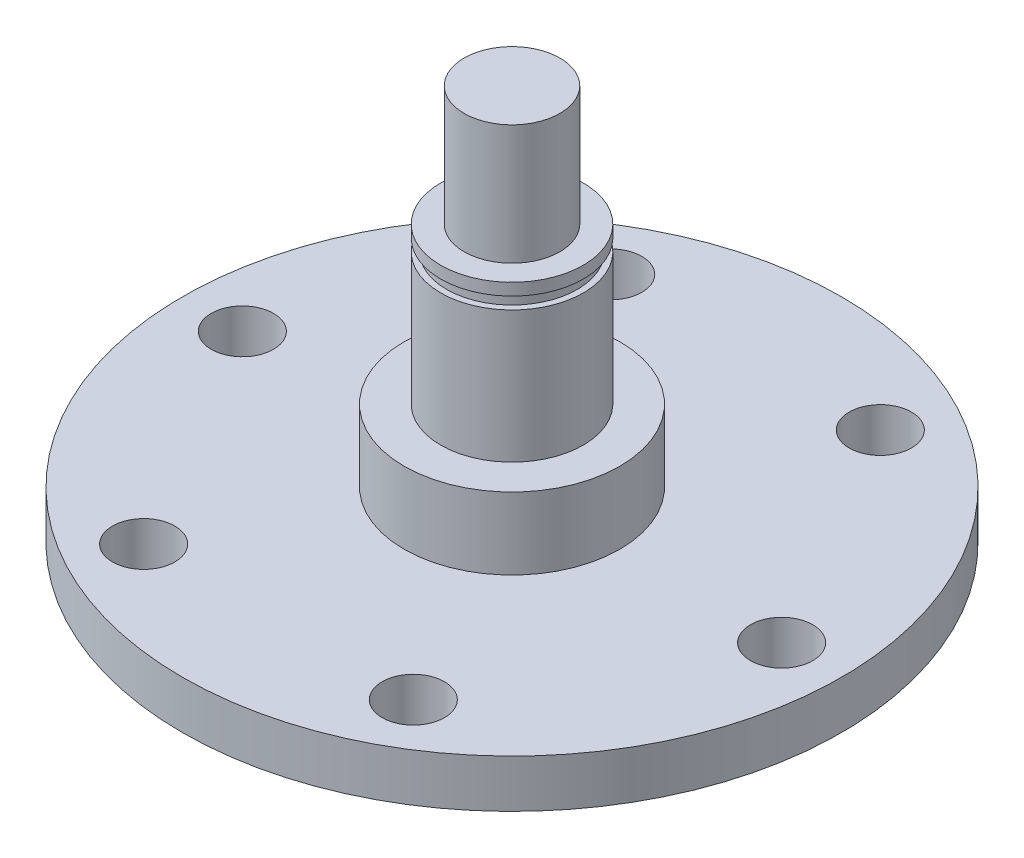
ISO-10303-21;
HEADER;
FILE_DESCRIPTION(('STEP AP214'),'2;1');
FILE_NAME('part.step','',(''),(''),'','','');
FILE_SCHEMA(('AUTOMOTIVE_DESIGN { 1 0 10303 214 1 1 1 1 }'));
ENDSEC;
DATA;
#1=APPLICATION_CONTEXT('core data for automotive mechanical design processes');
#2=APPLICATION_PROTOCOL_DEFINITION('international standard','automotive_design',2000,#1);
#3=PRODUCT_CONTEXT('',#1,'mechanical');
#4=PRODUCT('Part','Part','',(#3));
#5=PRODUCT_RELATED_PRODUCT_CATEGORY('part','',(#4));
#6=PRODUCT_DEFINITION_FORMATION('','',#4);
#7=PRODUCT_DEFINITION_CONTEXT('part definition',#1,'design');
#8=PRODUCT_DEFINITION('design','',#6,#7);
#9=PRODUCT_DEFINITION_SHAPE('','',#8);
#10=(LENGTH_UNIT() NAMED_UNIT(*) SI_UNIT(.MILLI.,.METRE.));
#11=(NAMED_UNIT(*) PLANE_ANGLE_UNIT() SI_UNIT($,.RADIAN.));
#12=(NAMED_UNIT(*) SI_UNIT($,.STERADIAN.) SOLID_ANGLE_UNIT());
#13=UNCERTAINTY_MEASURE_WITH_UNIT(LENGTH_MEASURE(1.E-05),#10,'distance_accuracy_value','');
#14=(GEOMETRIC_REPRESENTATION_CONTEXT(3) GLOBAL_UNCERTAINTY_ASSIGNED_CONTEXT((#13)) GLOBAL_UNIT_ASSIGNED_CONTEXT((#10,
#11,#12)) REPRESENTATION_CONTEXT('',''));
#15=CARTESIAN_POINT('',(0.,0.,0.));
#16=DIRECTION('',(0.,0.,1.));
#17=DIRECTION('',(1.,0.,0.));
#18=AXIS2_PLACEMENT_3D('',#15,#16,#17);
#19=CARTESIAN_POINT('',(0.,0.,0.));
#20=DIRECTION('',(0.,1.,0.));
#21=DIRECTION('',(0.,0.,1.));
#22=AXIS2_PLACEMENT_3D('',#19,#20,#21);
#23=PLANE('',#22);
#24=CARTESIAN_POINT('',(11.2500000000002,0.,-19.4855715851497));
#25=DIRECTION('',(0.,1.,0.));
#26=DIRECTION('',(0.,0.,1.));
#27=AXIS2_PLACEMENT_3D('',#24,#25,#26);
#28=CIRCLE('',#27,2.6);
#29=CARTESIAN_POINT('',(11.2500000000002,0.,-16.8855715851497));
#30=VERTEX_POINT('',#29);
#31=EDGE_CURVE('E105',#30,#30,#28,.T.);
#32=ORIENTED_EDGE('',*,*,#31,.T.);
#33=EDGE_LOOP('',(#32));
#34=FACE_BOUND('',#33,.T.);
#35=CARTESIAN_POINT('',(-11.2499999999998,0.,-19.48557158515));
#36=DIRECTION('',(0.,1.,0.));
#37=DIRECTION('',(0.,0.,1.));
#38=AXIS2_PLACEMENT_3D('',#35,#36,#37);
#39=CIRCLE('',#38,2.6);
#40=CARTESIAN_POINT('',(-11.2499999999998,0.,-16.88557158515));
#41=VERTEX_POINT('',#40);
#42=EDGE_CURVE('E99',#41,#41,#39,.T.);
#43=ORIENTED_EDGE('',*,*,#42,.T.);
#44=EDGE_LOOP('',(#43));
#45=FACE_BOUND('',#44,.T.);
#46=CARTESIAN_POINT('',(-22.5,0.,-1.57116660247941E-13));
#47=DIRECTION('',(0.,1.,0.));
#48=DIRECTION('',(0.,0.,1.));
#49=AXIS2_PLACEMENT_3D('',#46,#47,#48);
#50=CIRCLE('',#49,2.6);
#51=CARTESIAN_POINT('',(-22.5,0.,2.59999999999984));
#52=VERTEX_POINT('',#51);
#53=EDGE_CURVE('E93',#52,#52,#50,.T.);
#54=ORIENTED_EDGE('',*,*,#53,.T.);
#55=EDGE_LOOP('',(#54));
#56=FACE_BOUND('',#55,.T.);
#57=CARTESIAN_POINT('',(-11.2500000000001,0.,19.4855715851498));
#58=DIRECTION('',(0.,1.,0.));
#59=DIRECTION('',(0.,0.,1.));
#60=AXIS2_PLACEMENT_3D('',#57,#58,#59);
#61=CIRCLE('',#60,2.6);
#62=CARTESIAN_POINT('',(-11.2500000000001,0.,22.0855715851498));
#63=VERTEX_POINT('',#62);
#64=EDGE_CURVE('E87',#63,#63,#61,.T.);
#65=ORIENTED_EDGE('',*,*,#64,.T.);
#66=EDGE_LOOP('',(#65));
#67=FACE_BOUND('',#66,.T.);
#68=CARTESIAN_POINT('',(11.25,0.,19.4855715851499));
#69=DIRECTION('',(0.,1.,0.));
#70=DIRECTION('',(0.,0.,1.));
#71=AXIS2_PLACEMENT_3D('',#68,#69,#70);
#72=CIRCLE('',#71,2.6);
#73=CARTESIAN_POINT('',(11.25,0.,22.0855715851499));
#74=VERTEX_POINT('',#73);
#75=EDGE_CURVE('E81',#74,#74,#72,.T.);
#76=ORIENTED_EDGE('',*,*,#75,.T.);
#77=EDGE_LOOP('',(#76));
#78=FACE_BOUND('',#77,.T.);
#79=CARTESIAN_POINT('',(22.5,0.,0.));
#80=DIRECTION('',(0.,1.,0.));
#81=DIRECTION('',(0.,0.,1.));
#82=AXIS2_PLACEMENT_3D('',#79,#80,#81);
#83=CIRCLE('',#82,2.6);
#84=CARTESIAN_POINT('',(22.5,0.,2.6));
#85=VERTEX_POINT('',#84);
#86=EDGE_CURVE('E77',#85,#85,#83,.T.);
#87=ORIENTED_EDGE('',*,*,#86,.T.);
#88=EDGE_LOOP('',(#87));
#89=FACE_BOUND('',#88,.T.);
#90=CARTESIAN_POINT('',(0.,0.,0.));
#91=DIRECTION('',(0.,1.,0.));
#92=DIRECTION('',(0.,0.,1.));
#93=AXIS2_PLACEMENT_3D('',#90,#91,#92);
#94=CIRCLE('',#93,27.5);
#95=CARTESIAN_POINT('',(0.,0.,27.5));
#96=VERTEX_POINT('',#95);
#97=EDGE_CURVE('E10',#96,#96,#94,.T.);
#98=ORIENTED_EDGE('',*,*,#97,.F.);
#99=EDGE_LOOP('',(#98));
#100=FACE_BOUND('',#99,.T.);
#101=ADVANCED_FACE('F34',(#34,#45,#56,#67,#78,#89,#100),#23,.F.);
#102=CARTESIAN_POINT('',(0.,23.5,0.));
#103=DIRECTION('',(0.,1.,0.));
#104=DIRECTION('',(0.,0.,1.));
#105=AXIS2_PLACEMENT_3D('',#102,#103,#104);
#106=CYLINDRICAL_SURFACE('',#105,27.5);
#107=CARTESIAN_POINT('',(0.,4.,0.));
#108=DIRECTION('',(0.,1.,0.));
#109=DIRECTION('',(0.,0.,1.));
#110=AXIS2_PLACEMENT_3D('',#107,#108,#109);
#111=CIRCLE('',#110,27.5);
#112=CARTESIAN_POINT('',(0.,4.,27.5));
#113=VERTEX_POINT('',#112);
#114=EDGE_CURVE('E40',#113,#113,#111,.T.);
#115=ORIENTED_EDGE('',*,*,#114,.F.);
#116=EDGE_LOOP('',(#115));
#117=FACE_BOUND('',#116,.T.);
#118=ORIENTED_EDGE('',*,*,#97,.T.);
#119=EDGE_LOOP('',(#118));
#120=FACE_BOUND('',#119,.T.);
#121=ADVANCED_FACE('F127',(#117,#120),#106,.T.);
#122=CARTESIAN_POINT('',(27.5,4.,0.));
#123=DIRECTION('',(0.,-1.,0.));
#124=DIRECTION('',(0.,0.,-1.));
#125=AXIS2_PLACEMENT_3D('',#122,#123,#124);
#126=PLANE('',#125);
#127=CARTESIAN_POINT('',(11.2500000000002,4.,-19.4855715851497));
#128=DIRECTION('',(0.,1.,0.));
#129=DIRECTION('',(0.,0.,1.));
#130=AXIS2_PLACEMENT_3D('',#127,#128,#129);
#131=CIRCLE('',#130,2.6);
#132=CARTESIAN_POINT('',(11.2500000000002,4.,-16.8855715851497));
#133=VERTEX_POINT('',#132);
#134=EDGE_CURVE('E108',#133,#133,#131,.T.);
#135=ORIENTED_EDGE('',*,*,#134,.F.);
#136=EDGE_LOOP('',(#135));
#137=FACE_BOUND('',#136,.T.);
#138=CARTESIAN_POINT('',(-11.2499999999998,4.,-19.48557158515));
#139=DIRECTION('',(0.,1.,0.));
#140=DIRECTION('',(0.,0.,1.));
#141=AXIS2_PLACEMENT_3D('',#138,#139,#140);
#142=CIRCLE('',#141,2.6);
#143=CARTESIAN_POINT('',(-11.2499999999998,4.,-16.88557158515));
#144=VERTEX_POINT('',#143);
#145=EDGE_CURVE('E102',#144,#144,#142,.T.);
#146=ORIENTED_EDGE('',*,*,#145,.F.);
#147=EDGE_LOOP('',(#146));
#148=FACE_BOUND('',#147,.T.);
#149=CARTESIAN_POINT('',(-22.5,4.,-1.57116660247941E-13));
#150=DIRECTION('',(0.,1.,0.));
#151=DIRECTION('',(0.,0.,1.));
#152=AXIS2_PLACEMENT_3D('',#149,#150,#151);
#153=CIRCLE('',#152,2.6);
#154=CARTESIAN_POINT('',(-22.5,4.,2.59999999999984));
#155=VERTEX_POINT('',#154);
#156=EDGE_CURVE('E96',#155,#155,#153,.T.);
#157=ORIENTED_EDGE('',*,*,#156,.F.);
#158=EDGE_LOOP('',(#157));
#159=FACE_BOUND('',#158,.T.);
#160=CARTESIAN_POINT('',(-11.2500000000001,4.,19.4855715851498));
#161=DIRECTION('',(0.,1.,0.));
#162=DIRECTION('',(0.,0.,1.));
#163=AXIS2_PLACEMENT_3D('',#160,#161,#162);
#164=CIRCLE('',#163,2.6);
#165=CARTESIAN_POINT('',(-11.2500000000001,4.,22.0855715851498));
#166=VERTEX_POINT('',#165);
#167=EDGE_CURVE('E90',#166,#166,#164,.T.);
#168=ORIENTED_EDGE('',*,*,#167,.F.);
#169=EDGE_LOOP('',(#168));
#170=FACE_BOUND('',#169,.T.);
#171=CARTESIAN_POINT('',(11.25,4.,19.4855715851499));
#172=DIRECTION('',(0.,1.,0.));
#173=DIRECTION('',(0.,0.,1.));
#174=AXIS2_PLACEMENT_3D('',#171,#172,#173);
#175=CIRCLE('',#174,2.6);
#176=CARTESIAN_POINT('',(11.25,4.,22.0855715851499));
#177=VERTEX_POINT('',#176);
#178=EDGE_CURVE('E84',#177,#177,#175,.T.);
#179=ORIENTED_EDGE('',*,*,#178,.F.);
#180=EDGE_LOOP('',(#179));
#181=FACE_BOUND('',#180,.T.);
#182=CARTESIAN_POINT('',(22.5,4.,0.));
#183=DIRECTION('',(0.,1.,0.));
#184=DIRECTION('',(0.,0.,1.));
#185=AXIS2_PLACEMENT_3D('',#182,#183,#184);
#186=CIRCLE('',#185,2.6);
#187=CARTESIAN_POINT('',(22.5,4.,2.6));
#188=VERTEX_POINT('',#187);
#189=EDGE_CURVE('E78',#188,#188,#186,.T.);
#190=ORIENTED_EDGE('',*,*,#189,.F.);
#191=EDGE_LOOP('',(#190));
#192=FACE_BOUND('',#191,.T.);
#193=CARTESIAN_POINT('',(0.,4.,0.));
#194=DIRECTION('',(0.,1.,0.));
#195=DIRECTION('',(0.,0.,1.));
#196=AXIS2_PLACEMENT_3D('',#193,#194,#195);
#197=CIRCLE('',#196,9.);
#198=CARTESIAN_POINT('',(0.,4.,9.));
#199=VERTEX_POINT('',#198);
#200=EDGE_CURVE('E44',#199,#199,#197,.T.);
#201=ORIENTED_EDGE('',*,*,#200,.F.);
#202=EDGE_LOOP('',(#201));
#203=FACE_BOUND('',#202,.T.);
#204=ORIENTED_EDGE('',*,*,#114,.T.);
#205=EDGE_LOOP('',(#204));
#206=FACE_BOUND('',#205,.T.);
#207=ADVANCED_FACE('F123',(#137,#148,#159,#170,#181,#192,#203,#206),#126,.F.);
#208=CARTESIAN_POINT('',(0.,23.5,0.));
#209=DIRECTION('',(0.,1.,0.));
#210=DIRECTION('',(0.,0.,1.));
#211=AXIS2_PLACEMENT_3D('',#208,#209,#210);
#212=CYLINDRICAL_SURFACE('',#211,9.);
#213=CARTESIAN_POINT('',(0.,10.,0.));
#214=DIRECTION('',(0.,1.,0.));
#215=DIRECTION('',(0.,0.,1.));
#216=AXIS2_PLACEMENT_3D('',#213,#214,#215);
#217=CIRCLE('',#216,9.);
#218=CARTESIAN_POINT('',(0.,10.,9.));
#219=VERTEX_POINT('',#218);
#220=EDGE_CURVE('E48',#219,#219,#217,.T.);
#221=ORIENTED_EDGE('',*,*,#220,.F.);
#222=EDGE_LOOP('',(#221));
#223=FACE_BOUND('',#222,.T.);
#224=ORIENTED_EDGE('',*,*,#200,.T.);
#225=EDGE_LOOP('',(#224));
#226=FACE_BOUND('',#225,.T.);
#227=ADVANCED_FACE('F126',(#223,#226),#212,.T.);
#228=CARTESIAN_POINT('',(9.,10.,0.));
#229=DIRECTION('',(0.,-1.,0.));
#230=DIRECTION('',(0.,0.,-1.));
#231=AXIS2_PLACEMENT_3D('',#228,#229,#230);
#232=PLANE('',#231);
#233=CARTESIAN_POINT('',(0.,10.,0.));
#234=DIRECTION('',(0.,1.,0.));
#235=DIRECTION('',(0.,0.,1.));
#236=AXIS2_PLACEMENT_3D('',#233,#234,#235);
#237=CIRCLE('',#236,5.95);
#238=CARTESIAN_POINT('',(0.,10.,5.95));
#239=VERTEX_POINT('',#238);
#240=EDGE_CURVE('E53',#239,#239,#237,.T.);
#241=ORIENTED_EDGE('',*,*,#240,.F.);
#242=EDGE_LOOP('',(#241));
#243=FACE_BOUND('',#242,.T.);
#244=ORIENTED_EDGE('',*,*,#220,.T.);
#245=EDGE_LOOP('',(#244));
#246=FACE_BOUND('',#245,.T.);
#247=ADVANCED_FACE('F142',(#243,#246),#232,.F.);
#248=CARTESIAN_POINT('',(0.,23.5,0.));
#249=DIRECTION('',(0.,1.,0.));
#250=DIRECTION('',(0.,0.,1.));
#251=AXIS2_PLACEMENT_3D('',#248,#249,#250);
#252=CYLINDRICAL_SURFACE('',#251,5.95);
#253=CARTESIAN_POINT('',(0.,21.,0.));
#254=DIRECTION('',(0.,1.,0.));
#255=DIRECTION('',(0.,0.,1.));
#256=AXIS2_PLACEMENT_3D('',#253,#254,#255);
#257=CIRCLE('',#256,5.95);
#258=CARTESIAN_POINT('',(0.,21.,5.95));
#259=VERTEX_POINT('',#258);
#260=EDGE_CURVE('E56',#259,#259,#257,.T.);
#261=ORIENTED_EDGE('',*,*,#260,.F.);
#262=EDGE_LOOP('',(#261));
#263=FACE_BOUND('',#262,.T.);
#264=ORIENTED_EDGE('',*,*,#240,.T.);
#265=EDGE_LOOP('',(#264));
#266=FACE_BOUND('',#265,.T.);
#267=ADVANCED_FACE('F148',(#263,#266),#252,.T.);
#268=CARTESIAN_POINT('',(5.95,21.,0.));
#269=DIRECTION('',(0.,-1.,0.));
#270=DIRECTION('',(0.,0.,-1.));
#271=AXIS2_PLACEMENT_3D('',#268,#269,#270);
#272=PLANE('',#271);
#273=CARTESIAN_POINT('',(0.,21.,0.));
#274=DIRECTION('',(0.,1.,0.));
#275=DIRECTION('',(0.,0.,1.));
#276=AXIS2_PLACEMENT_3D('',#273,#274,#275);
#277=CIRCLE('',#276,5.45);
#278=CARTESIAN_POINT('',(0.,21.,5.45));
#279=VERTEX_POINT('',#278);
#280=EDGE_CURVE('E59',#279,#279,#277,.T.);
#281=ORIENTED_EDGE('',*,*,#280,.F.);
#282=EDGE_LOOP('',(#281));
#283=FACE_BOUND('',#282,.T.);
#284=ORIENTED_EDGE('',*,*,#260,.T.);
#285=EDGE_LOOP('',(#284));
#286=FACE_BOUND('',#285,.T.);
#287=ADVANCED_FACE('F253',(#283,#286),#272,.F.);
#288=CARTESIAN_POINT('',(0.,23.5,0.));
#289=DIRECTION('',(0.,1.,0.));
#290=DIRECTION('',(0.,0.,1.));
#291=AXIS2_PLACEMENT_3D('',#288,#289,#290);
#292=CYLINDRICAL_SURFACE('',#291,5.45);
#293=CARTESIAN_POINT('',(0.,22.,0.));
#294=DIRECTION('',(0.,1.,0.));
#295=DIRECTION('',(0.,0.,1.));
#296=AXIS2_PLACEMENT_3D('',#293,#294,#295);
#297=CIRCLE('',#296,5.45);
#298=CARTESIAN_POINT('',(0.,22.,5.45));
#299=VERTEX_POINT('',#298);
#300=EDGE_CURVE('E62',#299,#299,#297,.T.);
#301=ORIENTED_EDGE('',*,*,#300,.F.);
#302=EDGE_LOOP('',(#301));
#303=FACE_BOUND('',#302,.T.);
#304=ORIENTED_EDGE('',*,*,#280,.T.);
#305=EDGE_LOOP('',(#304));
#306=FACE_BOUND('',#305,.T.);
#307=ADVANCED_FACE('F249',(#303,#306),#292,.T.);
#308=CARTESIAN_POINT('',(5.45,22.,0.));
#309=DIRECTION('',(0.,1.,0.));
#310=DIRECTION('',(0.,0.,1.));
#311=AXIS2_PLACEMENT_3D('',#308,#309,#310);
#312=PLANE('',#311);
#313=CARTESIAN_POINT('',(0.,22.,0.));
#314=DIRECTION('',(0.,1.,0.));
#315=DIRECTION('',(0.,0.,1.));
#316=AXIS2_PLACEMENT_3D('',#313,#314,#315);
#317=CIRCLE('',#316,5.95);
#318=CARTESIAN_POINT('',(0.,22.,5.95));
#319=VERTEX_POINT('',#318);
#320=EDGE_CURVE('E65',#319,#319,#317,.T.);
#321=ORIENTED_EDGE('',*,*,#320,.F.);
#322=EDGE_LOOP('',(#321));
#323=FACE_BOUND('',#322,.T.);
#324=ORIENTED_EDGE('',*,*,#300,.T.);
#325=EDGE_LOOP('',(#324));
#326=FACE_BOUND('',#325,.T.);
#327=ADVANCED_FACE('F245',(#323,#326),#312,.F.);
#328=CARTESIAN_POINT('',(0.,23.5,0.));
#329=DIRECTION('',(0.,1.,0.));
#330=DIRECTION('',(0.,0.,1.));
#331=AXIS2_PLACEMENT_3D('',#328,#329,#330);
#332=CYLINDRICAL_SURFACE('',#331,5.95);
#333=CARTESIAN_POINT('',(0.,23.,0.));
#334=DIRECTION('',(0.,1.,0.));
#335=DIRECTION('',(0.,0.,1.));
#336=AXIS2_PLACEMENT_3D('',#333,#334,#335);
#337=CIRCLE('',#336,5.95);
#338=CARTESIAN_POINT('',(0.,23.,5.95));
#339=VERTEX_POINT('',#338);
#340=EDGE_CURVE('E68',#339,#339,#337,.T.);
#341=ORIENTED_EDGE('',*,*,#340,.F.);
#342=EDGE_LOOP('',(#341));
#343=FACE_BOUND('',#342,.T.);
#344=ORIENTED_EDGE('',*,*,#320,.T.);
#345=EDGE_LOOP('',(#344));
#346=FACE_BOUND('',#345,.T.);
#347=ADVANCED_FACE('F241',(#343,#346),#332,.T.);
#348=CARTESIAN_POINT('',(5.95,23.,0.));
#349=DIRECTION('',(0.,-1.,0.));
#350=DIRECTION('',(0.,0.,-1.));
#351=AXIS2_PLACEMENT_3D('',#348,#349,#350);
#352=PLANE('',#351);
#353=CARTESIAN_POINT('',(0.,23.,0.));
#354=DIRECTION('',(0.,1.,0.));
#355=DIRECTION('',(0.,0.,1.));
#356=AXIS2_PLACEMENT_3D('',#353,#354,#355);
#357=CIRCLE('',#356,4.);
#358=CARTESIAN_POINT('',(0.,23.,4.));
#359=VERTEX_POINT('',#358);
#360=EDGE_CURVE('E71',#359,#359,#357,.T.);
#361=ORIENTED_EDGE('',*,*,#360,.F.);
#362=EDGE_LOOP('',(#361));
#363=FACE_BOUND('',#362,.T.);
#364=ORIENTED_EDGE('',*,*,#340,.T.);
#365=EDGE_LOOP('',(#364));
#366=FACE_BOUND('',#365,.T.);
#367=ADVANCED_FACE('F237',(#363,#366),#352,.F.);
#368=CARTESIAN_POINT('',(0.,23.5,0.));
#369=DIRECTION('',(0.,1.,0.));
#370=DIRECTION('',(0.,0.,1.));
#371=AXIS2_PLACEMENT_3D('',#368,#369,#370);
#372=CYLINDRICAL_SURFACE('',#371,4.);
#373=CARTESIAN_POINT('',(0.,33.,0.));
#374=DIRECTION('',(0.,1.,0.));
#375=DIRECTION('',(0.,0.,1.));
#376=AXIS2_PLACEMENT_3D('',#373,#374,#375);
#377=CIRCLE('',#376,4.);
#378=CARTESIAN_POINT('',(0.,33.,4.));
#379=VERTEX_POINT('',#378);
#380=EDGE_CURVE('E74',#379,#379,#377,.T.);
#381=ORIENTED_EDGE('',*,*,#380,.F.);
#382=EDGE_LOOP('',(#381));
#383=FACE_BOUND('',#382,.T.);
#384=ORIENTED_EDGE('',*,*,#360,.T.);
#385=EDGE_LOOP('',(#384));
#386=FACE_BOUND('',#385,.T.);
#387=ADVANCED_FACE('F233',(#383,#386),#372,.T.);
#388=CARTESIAN_POINT('',(4.,33.,0.));
#389=DIRECTION('',(0.,-1.,0.));
#390=DIRECTION('',(0.,0.,-1.));
#391=AXIS2_PLACEMENT_3D('',#388,#389,#390);
#392=PLANE('',#391);
#393=ORIENTED_EDGE('',*,*,#380,.T.);
#394=EDGE_LOOP('',(#393));
#395=FACE_BOUND('',#394,.T.);
#396=ADVANCED_FACE('F178',(#395),#392,.F.);
#397=CARTESIAN_POINT('',(22.5,0.,0.));
#398=DIRECTION('',(0.,1.,0.));
#399=DIRECTION('',(0.,0.,1.));
#400=AXIS2_PLACEMENT_3D('',#397,#398,#399);
#401=CYLINDRICAL_SURFACE('',#400,2.6);
#402=ORIENTED_EDGE('',*,*,#86,.F.);
#403=EDGE_LOOP('',(#402));
#404=FACE_BOUND('',#403,.T.);
#405=ORIENTED_EDGE('',*,*,#189,.T.);
#406=EDGE_LOOP('',(#405));
#407=FACE_BOUND('',#406,.T.);
#408=ADVANCED_FACE('F172',(#404,#407),#401,.F.);
#409=CARTESIAN_POINT('',(11.25,0.,19.4855715851499));
#410=DIRECTION('',(0.,1.,0.));
#411=DIRECTION('',(0.,0.,1.));
#412=AXIS2_PLACEMENT_3D('',#409,#410,#411);
#413=CYLINDRICAL_SURFACE('',#412,2.6);
#414=ORIENTED_EDGE('',*,*,#75,.F.);
#415=EDGE_LOOP('',(#414));
#416=FACE_BOUND('',#415,.T.);
#417=ORIENTED_EDGE('',*,*,#178,.T.);
#418=EDGE_LOOP('',(#417));
#419=FACE_BOUND('',#418,.T.);
#420=ADVANCED_FACE('F177',(#416,#419),#413,.F.);
#421=CARTESIAN_POINT('',(-11.2500000000001,0.,19.4855715851498));
#422=DIRECTION('',(0.,1.,0.));
#423=DIRECTION('',(0.,0.,1.));
#424=AXIS2_PLACEMENT_3D('',#421,#422,#423);
#425=CYLINDRICAL_SURFACE('',#424,2.6);
#426=ORIENTED_EDGE('',*,*,#64,.F.);
#427=EDGE_LOOP('',(#426));
#428=FACE_BOUND('',#427,.T.);
#429=ORIENTED_EDGE('',*,*,#167,.T.);
#430=EDGE_LOOP('',(#429));
#431=FACE_BOUND('',#430,.T.);
#432=ADVANCED_FACE('F190',(#428,#431),#425,.F.);
#433=CARTESIAN_POINT('',(-22.5,0.,-1.57116660247941E-13));
#434=DIRECTION('',(0.,1.,0.));
#435=DIRECTION('',(0.,0.,1.));
#436=AXIS2_PLACEMENT_3D('',#433,#434,#435);
#437=CYLINDRICAL_SURFACE('',#436,2.6);
#438=ORIENTED_EDGE('',*,*,#53,.F.);
#439=EDGE_LOOP('',(#438));
#440=FACE_BOUND('',#439,.T.);
#441=ORIENTED_EDGE('',*,*,#156,.T.);
#442=EDGE_LOOP('',(#441));
#443=FACE_BOUND('',#442,.T.);
#444=ADVANCED_FACE('F200',(#440,#443),#437,.F.);
#445=CARTESIAN_POINT('',(-11.2499999999998,0.,-19.48557158515));
#446=DIRECTION('',(0.,1.,0.));
#447=DIRECTION('',(0.,0.,1.));
#448=AXIS2_PLACEMENT_3D('',#445,#446,#447);
#449=CYLINDRICAL_SURFACE('',#448,2.6);
#450=ORIENTED_EDGE('',*,*,#42,.F.);
#451=EDGE_LOOP('',(#450));
#452=FACE_BOUND('',#451,.T.);
#453=ORIENTED_EDGE('',*,*,#145,.T.);
#454=EDGE_LOOP('',(#453));
#455=FACE_BOUND('',#454,.T.);
#456=ADVANCED_FACE('F119',(#452,#455),#449,.F.);
#457=CARTESIAN_POINT('',(11.2500000000002,0.,-19.4855715851497));
#458=DIRECTION('',(0.,1.,0.));
#459=DIRECTION('',(0.,0.,1.));
#460=AXIS2_PLACEMENT_3D('',#457,#458,#459);
#461=CYLINDRICAL_SURFACE('',#460,2.6);
#462=ORIENTED_EDGE('',*,*,#31,.F.);
#463=EDGE_LOOP('',(#462));
#464=FACE_BOUND('',#463,.T.);
#465=ORIENTED_EDGE('',*,*,#134,.T.);
#466=EDGE_LOOP('',(#465));
#467=FACE_BOUND('',#466,.T.);
#468=ADVANCED_FACE('F116',(#464,#467),#461,.F.);
#469=CLOSED_SHELL('',(#101,#121,#207,#227,#247,#267,#287,#307,#327,#347,#367,#387,#396,#408,
#420,#432,#444,#456,#468));
#470=MANIFOLD_SOLID_BREP('B2',#469);
#471=ADVANCED_BREP_SHAPE_REPRESENTATION('',(#18,#470),#14);
#472=SHAPE_DEFINITION_REPRESENTATION(#9,#471);
ENDSEC;
END-ISO-10303-21;
